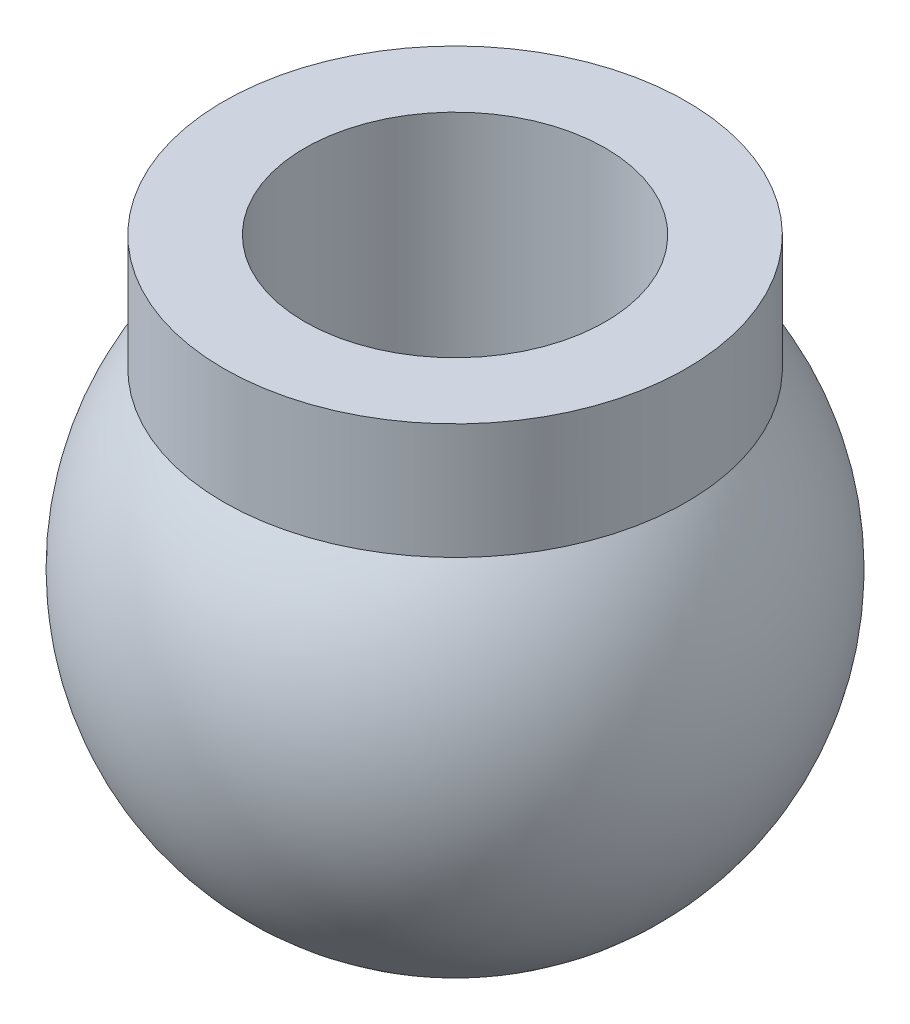
ISO-10303-21;
HEADER;
FILE_DESCRIPTION(('STEP AP214'),'2;1');
FILE_NAME('part.step','',(''),(''),'','','');
FILE_SCHEMA(('AUTOMOTIVE_DESIGN { 1 0 10303 214 1 1 1 1 }'));
ENDSEC;
DATA;
#1=APPLICATION_CONTEXT('core data for automotive mechanical design processes');
#2=APPLICATION_PROTOCOL_DEFINITION('international standard','automotive_design',2000,#1);
#3=PRODUCT_CONTEXT('',#1,'mechanical');
#4=PRODUCT('Part','Part','',(#3));
#5=PRODUCT_RELATED_PRODUCT_CATEGORY('part','',(#4));
#6=PRODUCT_DEFINITION_FORMATION('','',#4);
#7=PRODUCT_DEFINITION_CONTEXT('part definition',#1,'design');
#8=PRODUCT_DEFINITION('design','',#6,#7);
#9=PRODUCT_DEFINITION_SHAPE('','',#8);
#10=(LENGTH_UNIT() NAMED_UNIT(*) SI_UNIT(.MILLI.,.METRE.));
#11=(NAMED_UNIT(*) PLANE_ANGLE_UNIT() SI_UNIT($,.RADIAN.));
#12=(NAMED_UNIT(*) SI_UNIT($,.STERADIAN.) SOLID_ANGLE_UNIT());
#13=UNCERTAINTY_MEASURE_WITH_UNIT(LENGTH_MEASURE(1.E-05),#10,'distance_accuracy_value','');
#14=(GEOMETRIC_REPRESENTATION_CONTEXT(3) GLOBAL_UNCERTAINTY_ASSIGNED_CONTEXT((#13)) GLOBAL_UNIT_ASSIGNED_CONTEXT((#10,
#11,#12)) REPRESENTATION_CONTEXT('',''));
#15=CARTESIAN_POINT('',(0.,0.,0.));
#16=DIRECTION('',(0.,0.,1.));
#17=DIRECTION('',(1.,0.,0.));
#18=AXIS2_PLACEMENT_3D('',#15,#16,#17);
#19=CARTESIAN_POINT('',(0.,0.,0.));
#20=DIRECTION('',(1.,0.,0.));
#21=DIRECTION('',(0.,-1.,0.));
#22=AXIS2_PLACEMENT_3D('',#19,#20,#21);
#23=SPHERICAL_SURFACE('',#22,2.5);
#24=CARTESIAN_POINT('',(0.,0.,0.));
#25=DIRECTION('',(0.,1.,0.));
#26=DIRECTION('',(0.,0.,1.));
#27=AXIS2_PLACEMENT_3D('',#24,#25,#26);
#28=SPHERICAL_SURFACE('',#27,2.5);
#29=CARTESIAN_POINT('',(0.,-2.13541565040626,0.));
#30=DIRECTION('',(0.,1.,0.));
#31=DIRECTION('',(0.,0.,1.));
#32=AXIS2_PLACEMENT_3D('',#29,#30,#31);
#33=CIRCLE('',#32,1.3);
#34=CARTESIAN_POINT('',(0.,-2.13541565040626,1.3));
#35=VERTEX_POINT('',#34);
#36=EDGE_CURVE('E44',#35,#35,#33,.T.);
#37=ORIENTED_EDGE('',*,*,#36,.T.);
#38=EDGE_LOOP('',(#37));
#39=FACE_BOUND('',#38,.T.);
#40=CARTESIAN_POINT('',(0.,1.5,0.));
#41=DIRECTION('',(0.,-1.,0.));
#42=DIRECTION('',(0.,0.,-1.));
#43=AXIS2_PLACEMENT_3D('',#40,#41,#42);
#44=CIRCLE('',#43,2.);
#45=CARTESIAN_POINT('',(0.,1.5,-2.));
#46=VERTEX_POINT('',#45);
#47=EDGE_CURVE('E10',#46,#46,#44,.F.);
#48=ORIENTED_EDGE('',*,*,#47,.F.);
#49=EDGE_LOOP('',(#48));
#50=FACE_BOUND('',#49,.T.);
#51=ADVANCED_FACE('F37',(#39,#50),#28,.T.);
#52=CARTESIAN_POINT('',(0.,-15.,0.));
#53=DIRECTION('',(0.,1.,0.));
#54=DIRECTION('',(0.,0.,1.));
#55=AXIS2_PLACEMENT_3D('',#52,#53,#54);
#56=CYLINDRICAL_SURFACE('',#55,1.3);
#57=ORIENTED_EDGE('',*,*,#36,.F.);
#58=EDGE_LOOP('',(#57));
#59=FACE_BOUND('',#58,.T.);
#60=CARTESIAN_POINT('',(0.,2.5,0.));
#61=DIRECTION('',(0.,1.,0.));
#62=DIRECTION('',(0.,0.,1.));
#63=AXIS2_PLACEMENT_3D('',#60,#61,#62);
#64=CIRCLE('',#63,1.3);
#65=CARTESIAN_POINT('',(0.,2.5,1.3));
#66=VERTEX_POINT('',#65);
#67=EDGE_CURVE('E54',#66,#66,#64,.T.);
#68=ORIENTED_EDGE('',*,*,#67,.T.);
#69=EDGE_LOOP('',(#68));
#70=FACE_BOUND('',#69,.T.);
#71=ADVANCED_FACE('F61',(#59,#70),#56,.F.);
#72=CARTESIAN_POINT('',(0.,2.5,0.));
#73=DIRECTION('',(0.,-1.,0.));
#74=DIRECTION('',(0.,0.,-1.));
#75=AXIS2_PLACEMENT_3D('',#72,#73,#74);
#76=CYLINDRICAL_SURFACE('',#75,2.);
#77=CARTESIAN_POINT('',(0.,2.5,0.));
#78=DIRECTION('',(0.,1.,0.));
#79=DIRECTION('',(0.,0.,1.));
#80=AXIS2_PLACEMENT_3D('',#77,#78,#79);
#81=CIRCLE('',#80,2.);
#82=CARTESIAN_POINT('',(0.,2.5,2.));
#83=VERTEX_POINT('',#82);
#84=EDGE_CURVE('E49',#83,#83,#81,.T.);
#85=ORIENTED_EDGE('',*,*,#84,.F.);
#86=EDGE_LOOP('',(#85));
#87=FACE_BOUND('',#86,.T.);
#88=ORIENTED_EDGE('',*,*,#47,.T.);
#89=EDGE_LOOP('',(#88));
#90=FACE_BOUND('',#89,.T.);
#91=ADVANCED_FACE('F65',(#87,#90),#76,.T.);
#92=CARTESIAN_POINT('',(0.,2.5,0.));
#93=DIRECTION('',(0.,1.,0.));
#94=DIRECTION('',(0.,0.,1.));
#95=AXIS2_PLACEMENT_3D('',#92,#93,#94);
#96=PLANE('',#95);
#97=ORIENTED_EDGE('',*,*,#84,.T.);
#98=EDGE_LOOP('',(#97));
#99=FACE_BOUND('',#98,.T.);
#100=ORIENTED_EDGE('',*,*,#67,.F.);
#101=EDGE_LOOP('',(#100));
#102=FACE_BOUND('',#101,.T.);
#103=ADVANCED_FACE('F63',(#99,#102),#96,.T.);
#104=CLOSED_SHELL('',(#51,#71,#91,#103));
#105=MANIFOLD_SOLID_BREP('B2',#104);
#106=ADVANCED_BREP_SHAPE_REPRESENTATION('',(#18,#105),#14);
#107=SHAPE_DEFINITION_REPRESENTATION(#9,#106);
ENDSEC;
END-ISO-10303-21;
